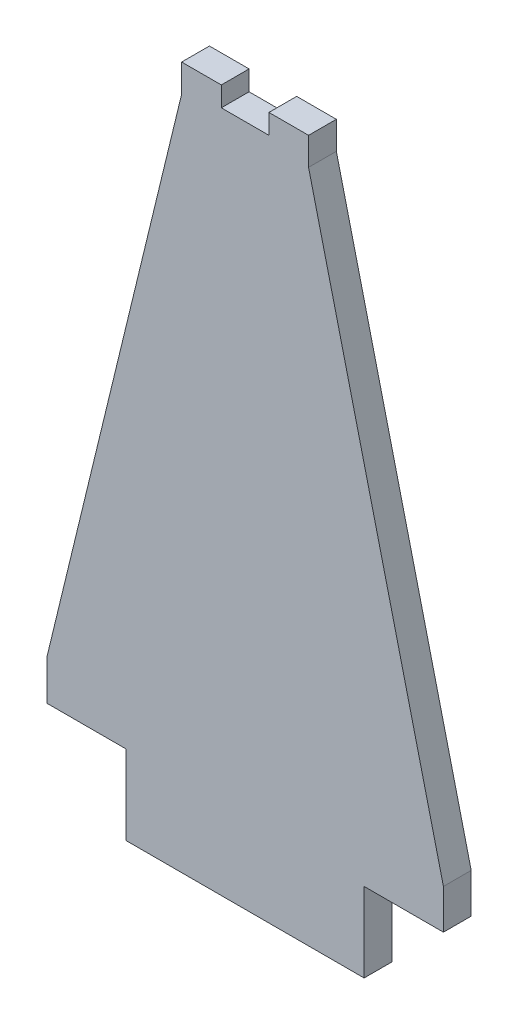
ISO-10303-21;
HEADER;
FILE_DESCRIPTION(('STEP AP214'),'2;1');
FILE_NAME('part.step','',(''),(''),'','','');
FILE_SCHEMA(('AUTOMOTIVE_DESIGN { 1 0 10303 214 1 1 1 1 }'));
ENDSEC;
DATA;
#1=APPLICATION_CONTEXT('core data for automotive mechanical design processes');
#2=APPLICATION_PROTOCOL_DEFINITION('international standard','automotive_design',2000,#1);
#3=PRODUCT_CONTEXT('',#1,'mechanical');
#4=PRODUCT('Part','Part','',(#3));
#5=PRODUCT_RELATED_PRODUCT_CATEGORY('part','',(#4));
#6=PRODUCT_DEFINITION_FORMATION('','',#4);
#7=PRODUCT_DEFINITION_CONTEXT('part definition',#1,'design');
#8=PRODUCT_DEFINITION('design','',#6,#7);
#9=PRODUCT_DEFINITION_SHAPE('','',#8);
#10=(LENGTH_UNIT() NAMED_UNIT(*) SI_UNIT(.MILLI.,.METRE.));
#11=(NAMED_UNIT(*) PLANE_ANGLE_UNIT() SI_UNIT($,.RADIAN.));
#12=(NAMED_UNIT(*) SI_UNIT($,.STERADIAN.) SOLID_ANGLE_UNIT());
#13=UNCERTAINTY_MEASURE_WITH_UNIT(LENGTH_MEASURE(1.E-05),#10,'distance_accuracy_value','');
#14=(GEOMETRIC_REPRESENTATION_CONTEXT(3) GLOBAL_UNCERTAINTY_ASSIGNED_CONTEXT((#13)) GLOBAL_UNIT_ASSIGNED_CONTEXT((#10,
#11,#12)) REPRESENTATION_CONTEXT('',''));
#15=CARTESIAN_POINT('',(0.,0.,0.));
#16=DIRECTION('',(0.,0.,1.));
#17=DIRECTION('',(1.,0.,0.));
#18=AXIS2_PLACEMENT_3D('',#15,#16,#17);
#19=CARTESIAN_POINT('',(0.,1.,0.175));
#20=DIRECTION('',(1.,0.,0.));
#21=DIRECTION('',(0.,1.,0.));
#22=AXIS2_PLACEMENT_3D('',#19,#20,#21);
#23=PLANE('',#22);
#24=DIRECTION('',(0.,-1.,0.));
#25=VECTOR('',#24,1.);
#26=CARTESIAN_POINT('',(0.,1.,-0.175));
#27=LINE('',#26,#25);
#28=CARTESIAN_POINT('',(0.,1.,-0.175));
#29=VERTEX_POINT('',#28);
#30=CARTESIAN_POINT('',(0.,0.,-0.175));
#31=VERTEX_POINT('',#30);
#32=EDGE_CURVE('E188',#29,#31,#27,.T.);
#33=ORIENTED_EDGE('',*,*,#32,.T.);
#34=DIRECTION('',(0.,0.,-1.));
#35=VECTOR('',#34,1.);
#36=CARTESIAN_POINT('',(0.,0.,0.175));
#37=LINE('',#36,#35);
#38=CARTESIAN_POINT('',(0.,0.,0.175));
#39=VERTEX_POINT('',#38);
#40=EDGE_CURVE('E11',#39,#31,#37,.T.);
#41=ORIENTED_EDGE('',*,*,#40,.F.);
#42=DIRECTION('',(0.,-1.,0.));
#43=VECTOR('',#42,1.);
#44=CARTESIAN_POINT('',(0.,1.,0.175));
#45=LINE('',#44,#43);
#46=CARTESIAN_POINT('',(0.,1.,0.175));
#47=VERTEX_POINT('',#46);
#48=EDGE_CURVE('E234',#47,#39,#45,.T.);
#49=ORIENTED_EDGE('',*,*,#48,.F.);
#50=DIRECTION('',(0.,0.,-1.));
#51=VECTOR('',#50,1.);
#52=CARTESIAN_POINT('',(0.,1.,0.175));
#53=LINE('',#52,#51);
#54=EDGE_CURVE('E184',#47,#29,#53,.T.);
#55=ORIENTED_EDGE('',*,*,#54,.T.);
#56=EDGE_LOOP('',(#33,#41,#49,#55));
#57=FACE_BOUND('',#56,.T.);
#58=ADVANCED_FACE('F39',(#57),#23,.F.);
#59=CARTESIAN_POINT('',(0.,0.,0.175));
#60=DIRECTION('',(0.,1.,0.));
#61=DIRECTION('',(-1.,0.,0.));
#62=AXIS2_PLACEMENT_3D('',#59,#60,#61);
#63=PLANE('',#62);
#64=DIRECTION('',(1.,0.,0.));
#65=VECTOR('',#64,1.);
#66=CARTESIAN_POINT('',(0.,0.,-0.175));
#67=LINE('',#66,#65);
#68=CARTESIAN_POINT('',(3.,0.,-0.175));
#69=VERTEX_POINT('',#68);
#70=EDGE_CURVE('E192',#31,#69,#67,.T.);
#71=ORIENTED_EDGE('',*,*,#70,.T.);
#72=DIRECTION('',(0.,0.,-1.));
#73=VECTOR('',#72,1.);
#74=CARTESIAN_POINT('',(3.,0.,0.175));
#75=LINE('',#74,#73);
#76=CARTESIAN_POINT('',(3.,0.,0.175));
#77=VERTEX_POINT('',#76);
#78=EDGE_CURVE('E48',#77,#69,#75,.T.);
#79=ORIENTED_EDGE('',*,*,#78,.F.);
#80=DIRECTION('',(1.,0.,0.));
#81=VECTOR('',#80,1.);
#82=CARTESIAN_POINT('',(0.,0.,0.175));
#83=LINE('',#82,#81);
#84=EDGE_CURVE('E123',#39,#77,#83,.T.);
#85=ORIENTED_EDGE('',*,*,#84,.F.);
#86=ORIENTED_EDGE('',*,*,#40,.T.);
#87=EDGE_LOOP('',(#71,#79,#85,#86));
#88=FACE_BOUND('',#87,.T.);
#89=ADVANCED_FACE('F356',(#88),#63,.F.);
#90=CARTESIAN_POINT('',(3.,0.,0.175));
#91=DIRECTION('',(-1.,0.,0.));
#92=DIRECTION('',(0.,0.,1.));
#93=AXIS2_PLACEMENT_3D('',#90,#91,#92);
#94=PLANE('',#93);
#95=DIRECTION('',(0.,1.,0.));
#96=VECTOR('',#95,1.);
#97=CARTESIAN_POINT('',(3.,0.,-0.175));
#98=LINE('',#97,#96);
#99=CARTESIAN_POINT('',(3.,1.,-0.175));
#100=VERTEX_POINT('',#99);
#101=EDGE_CURVE('E195',#69,#100,#98,.T.);
#102=ORIENTED_EDGE('',*,*,#101,.T.);
#103=DIRECTION('',(0.,0.,-1.));
#104=VECTOR('',#103,1.);
#105=CARTESIAN_POINT('',(3.,1.,0.175));
#106=LINE('',#105,#104);
#107=CARTESIAN_POINT('',(3.,1.,0.175));
#108=VERTEX_POINT('',#107);
#109=EDGE_CURVE('E277',#108,#100,#106,.T.);
#110=ORIENTED_EDGE('',*,*,#109,.F.);
#111=DIRECTION('',(0.,1.,0.));
#112=VECTOR('',#111,1.);
#113=CARTESIAN_POINT('',(3.,0.,0.175));
#114=LINE('',#113,#112);
#115=EDGE_CURVE('E287',#77,#108,#114,.T.);
#116=ORIENTED_EDGE('',*,*,#115,.F.);
#117=ORIENTED_EDGE('',*,*,#78,.T.);
#118=EDGE_LOOP('',(#102,#110,#116,#117));
#119=FACE_BOUND('',#118,.T.);
#120=ADVANCED_FACE('F285',(#119),#94,.F.);
#121=CARTESIAN_POINT('',(3.,1.,0.175));
#122=DIRECTION('',(0.,1.,0.));
#123=DIRECTION('',(-1.,0.,0.));
#124=AXIS2_PLACEMENT_3D('',#121,#122,#123);
#125=PLANE('',#124);
#126=DIRECTION('',(1.,0.,0.));
#127=VECTOR('',#126,1.);
#128=CARTESIAN_POINT('',(3.,1.,-0.175));
#129=LINE('',#128,#127);
#130=CARTESIAN_POINT('',(4.,1.,-0.175));
#131=VERTEX_POINT('',#130);
#132=EDGE_CURVE('E198',#100,#131,#129,.T.);
#133=ORIENTED_EDGE('',*,*,#132,.T.);
#134=DIRECTION('',(0.,0.,-1.));
#135=VECTOR('',#134,1.);
#136=CARTESIAN_POINT('',(4.,1.,0.175));
#137=LINE('',#136,#135);
#138=CARTESIAN_POINT('',(4.,1.,0.175));
#139=VERTEX_POINT('',#138);
#140=EDGE_CURVE('E273',#139,#131,#137,.T.);
#141=ORIENTED_EDGE('',*,*,#140,.F.);
#142=DIRECTION('',(1.,0.,0.));
#143=VECTOR('',#142,1.);
#144=CARTESIAN_POINT('',(3.,1.,0.175));
#145=LINE('',#144,#143);
#146=EDGE_CURVE('E306',#108,#139,#145,.T.);
#147=ORIENTED_EDGE('',*,*,#146,.F.);
#148=ORIENTED_EDGE('',*,*,#109,.T.);
#149=EDGE_LOOP('',(#133,#141,#147,#148));
#150=FACE_BOUND('',#149,.T.);
#151=ADVANCED_FACE('F296',(#150),#125,.F.);
#152=CARTESIAN_POINT('',(4.,1.,0.175));
#153=DIRECTION('',(-1.,0.,0.));
#154=DIRECTION('',(0.,0.,1.));
#155=AXIS2_PLACEMENT_3D('',#152,#153,#154);
#156=PLANE('',#155);
#157=DIRECTION('',(0.,1.,0.));
#158=VECTOR('',#157,1.);
#159=CARTESIAN_POINT('',(4.,1.,-0.175));
#160=LINE('',#159,#158);
#161=CARTESIAN_POINT('',(4.,1.5,-0.175));
#162=VERTEX_POINT('',#161);
#163=EDGE_CURVE('E201',#131,#162,#160,.T.);
#164=ORIENTED_EDGE('',*,*,#163,.T.);
#165=DIRECTION('',(0.,0.,-1.));
#166=VECTOR('',#165,1.);
#167=CARTESIAN_POINT('',(4.,1.5,0.175));
#168=LINE('',#167,#166);
#169=CARTESIAN_POINT('',(4.,1.5,0.175));
#170=VERTEX_POINT('',#169);
#171=EDGE_CURVE('E269',#170,#162,#168,.T.);
#172=ORIENTED_EDGE('',*,*,#171,.F.);
#173=DIRECTION('',(0.,1.,0.));
#174=VECTOR('',#173,1.);
#175=CARTESIAN_POINT('',(4.,1.,0.175));
#176=LINE('',#175,#174);
#177=EDGE_CURVE('E302',#139,#170,#176,.T.);
#178=ORIENTED_EDGE('',*,*,#177,.F.);
#179=ORIENTED_EDGE('',*,*,#140,.T.);
#180=EDGE_LOOP('',(#164,#172,#178,#179));
#181=FACE_BOUND('',#180,.T.);
#182=ADVANCED_FACE('F300',(#181),#156,.F.);
#183=CARTESIAN_POINT('',(4.,1.5,0.175));
#184=DIRECTION('',(-0.971753703944221,-0.235997328100739,0.));
#185=DIRECTION('',(0.235997328100739,-0.971753703944221,0.));
#186=AXIS2_PLACEMENT_3D('',#183,#184,#185);
#187=PLANE('',#186);
#188=DIRECTION('',(-0.23599732810074,0.971753703944221,0.));
#189=VECTOR('',#188,1.);
#190=CARTESIAN_POINT('',(4.,1.5,-0.175));
#191=LINE('',#190,#189);
#192=CARTESIAN_POINT('',(2.3,8.5,-0.175));
#193=VERTEX_POINT('',#192);
#194=EDGE_CURVE('E204',#162,#193,#191,.T.);
#195=ORIENTED_EDGE('',*,*,#194,.T.);
#196=DIRECTION('',(0.,0.,-1.));
#197=VECTOR('',#196,1.);
#198=CARTESIAN_POINT('',(2.3,8.5,0.175));
#199=LINE('',#198,#197);
#200=CARTESIAN_POINT('',(2.3,8.5,0.175));
#201=VERTEX_POINT('',#200);
#202=EDGE_CURVE('E265',#201,#193,#199,.T.);
#203=ORIENTED_EDGE('',*,*,#202,.F.);
#204=DIRECTION('',(-0.23599732810074,0.971753703944221,0.));
#205=VECTOR('',#204,1.);
#206=CARTESIAN_POINT('',(4.,1.5,0.175));
#207=LINE('',#206,#205);
#208=EDGE_CURVE('E305',#170,#201,#207,.T.);
#209=ORIENTED_EDGE('',*,*,#208,.F.);
#210=ORIENTED_EDGE('',*,*,#171,.T.);
#211=EDGE_LOOP('',(#195,#203,#209,#210));
#212=FACE_BOUND('',#211,.T.);
#213=ADVANCED_FACE('F369',(#212),#187,.F.);
#214=CARTESIAN_POINT('',(2.3,8.5,0.175));
#215=DIRECTION('',(-1.,0.,0.));
#216=DIRECTION('',(0.,0.,1.));
#217=AXIS2_PLACEMENT_3D('',#214,#215,#216);
#218=PLANE('',#217);
#219=DIRECTION('',(0.,1.,0.));
#220=VECTOR('',#219,1.);
#221=CARTESIAN_POINT('',(2.3,8.5,-0.175));
#222=LINE('',#221,#220);
#223=CARTESIAN_POINT('',(2.3,8.85,-0.175));
#224=VERTEX_POINT('',#223);
#225=EDGE_CURVE('E207',#193,#224,#222,.T.);
#226=ORIENTED_EDGE('',*,*,#225,.T.);
#227=DIRECTION('',(0.,0.,-1.));
#228=VECTOR('',#227,1.);
#229=CARTESIAN_POINT('',(2.3,8.85,0.175));
#230=LINE('',#229,#228);
#231=CARTESIAN_POINT('',(2.3,8.85,0.175));
#232=VERTEX_POINT('',#231);
#233=EDGE_CURVE('E261',#232,#224,#230,.T.);
#234=ORIENTED_EDGE('',*,*,#233,.F.);
#235=DIRECTION('',(0.,1.,0.));
#236=VECTOR('',#235,1.);
#237=CARTESIAN_POINT('',(2.3,8.5,0.175));
#238=LINE('',#237,#236);
#239=EDGE_CURVE('E310',#201,#232,#238,.T.);
#240=ORIENTED_EDGE('',*,*,#239,.F.);
#241=ORIENTED_EDGE('',*,*,#202,.T.);
#242=EDGE_LOOP('',(#226,#234,#240,#241));
#243=FACE_BOUND('',#242,.T.);
#244=ADVANCED_FACE('F372',(#243),#218,.F.);
#245=CARTESIAN_POINT('',(2.3,8.85,0.175));
#246=DIRECTION('',(0.,-1.,0.));
#247=DIRECTION('',(0.,0.,-1.));
#248=AXIS2_PLACEMENT_3D('',#245,#246,#247);
#249=PLANE('',#248);
#250=DIRECTION('',(-1.,0.,0.));
#251=VECTOR('',#250,1.);
#252=CARTESIAN_POINT('',(2.3,8.85,-0.175));
#253=LINE('',#252,#251);
#254=CARTESIAN_POINT('',(1.8,8.85,-0.175));
#255=VERTEX_POINT('',#254);
#256=EDGE_CURVE('E210',#224,#255,#253,.T.);
#257=ORIENTED_EDGE('',*,*,#256,.T.);
#258=DIRECTION('',(0.,0.,-1.));
#259=VECTOR('',#258,1.);
#260=CARTESIAN_POINT('',(1.8,8.85,0.175));
#261=LINE('',#260,#259);
#262=CARTESIAN_POINT('',(1.8,8.85,0.175));
#263=VERTEX_POINT('',#262);
#264=EDGE_CURVE('E257',#263,#255,#261,.T.);
#265=ORIENTED_EDGE('',*,*,#264,.F.);
#266=DIRECTION('',(-1.,0.,0.));
#267=VECTOR('',#266,1.);
#268=CARTESIAN_POINT('',(2.3,8.85,0.175));
#269=LINE('',#268,#267);
#270=EDGE_CURVE('E317',#232,#263,#269,.T.);
#271=ORIENTED_EDGE('',*,*,#270,.F.);
#272=ORIENTED_EDGE('',*,*,#233,.T.);
#273=EDGE_LOOP('',(#257,#265,#271,#272));
#274=FACE_BOUND('',#273,.T.);
#275=ADVANCED_FACE('F376',(#274),#249,.F.);
#276=CARTESIAN_POINT('',(1.8,8.85,0.175));
#277=DIRECTION('',(1.,0.,0.));
#278=DIRECTION('',(0.,1.,0.));
#279=AXIS2_PLACEMENT_3D('',#276,#277,#278);
#280=PLANE('',#279);
#281=DIRECTION('',(0.,-1.,0.));
#282=VECTOR('',#281,1.);
#283=CARTESIAN_POINT('',(1.8,8.85,-0.175));
#284=LINE('',#283,#282);
#285=CARTESIAN_POINT('',(1.8,8.6,-0.175));
#286=VERTEX_POINT('',#285);
#287=EDGE_CURVE('E213',#255,#286,#284,.T.);
#288=ORIENTED_EDGE('',*,*,#287,.T.);
#289=DIRECTION('',(0.,0.,-1.));
#290=VECTOR('',#289,1.);
#291=CARTESIAN_POINT('',(1.8,8.6,0.175));
#292=LINE('',#291,#290);
#293=CARTESIAN_POINT('',(1.8,8.6,0.175));
#294=VERTEX_POINT('',#293);
#295=EDGE_CURVE('E253',#294,#286,#292,.T.);
#296=ORIENTED_EDGE('',*,*,#295,.F.);
#297=DIRECTION('',(0.,-1.,0.));
#298=VECTOR('',#297,1.);
#299=CARTESIAN_POINT('',(1.8,8.85,0.175));
#300=LINE('',#299,#298);
#301=EDGE_CURVE('E320',#263,#294,#300,.T.);
#302=ORIENTED_EDGE('',*,*,#301,.F.);
#303=ORIENTED_EDGE('',*,*,#264,.T.);
#304=EDGE_LOOP('',(#288,#296,#302,#303));
#305=FACE_BOUND('',#304,.T.);
#306=ADVANCED_FACE('F380',(#305),#280,.F.);
#307=CARTESIAN_POINT('',(1.8,8.6,0.175));
#308=DIRECTION('',(0.,-1.,0.));
#309=DIRECTION('',(0.,0.,-1.));
#310=AXIS2_PLACEMENT_3D('',#307,#308,#309);
#311=PLANE('',#310);
#312=DIRECTION('',(-1.,0.,0.));
#313=VECTOR('',#312,1.);
#314=CARTESIAN_POINT('',(1.8,8.6,-0.175));
#315=LINE('',#314,#313);
#316=CARTESIAN_POINT('',(1.2,8.6,-0.175));
#317=VERTEX_POINT('',#316);
#318=EDGE_CURVE('E216',#286,#317,#315,.T.);
#319=ORIENTED_EDGE('',*,*,#318,.T.);
#320=DIRECTION('',(0.,0.,-1.));
#321=VECTOR('',#320,1.);
#322=CARTESIAN_POINT('',(1.2,8.6,0.175));
#323=LINE('',#322,#321);
#324=CARTESIAN_POINT('',(1.2,8.6,0.175));
#325=VERTEX_POINT('',#324);
#326=EDGE_CURVE('E249',#325,#317,#323,.T.);
#327=ORIENTED_EDGE('',*,*,#326,.F.);
#328=DIRECTION('',(-1.,0.,0.));
#329=VECTOR('',#328,1.);
#330=CARTESIAN_POINT('',(1.8,8.6,0.175));
#331=LINE('',#330,#329);
#332=EDGE_CURVE('E323',#294,#325,#331,.T.);
#333=ORIENTED_EDGE('',*,*,#332,.F.);
#334=ORIENTED_EDGE('',*,*,#295,.T.);
#335=EDGE_LOOP('',(#319,#327,#333,#334));
#336=FACE_BOUND('',#335,.T.);
#337=ADVANCED_FACE('F384',(#336),#311,.F.);
#338=CARTESIAN_POINT('',(1.2,8.6,0.175));
#339=DIRECTION('',(-1.,0.,0.));
#340=DIRECTION('',(0.,0.,1.));
#341=AXIS2_PLACEMENT_3D('',#338,#339,#340);
#342=PLANE('',#341);
#343=DIRECTION('',(0.,1.,0.));
#344=VECTOR('',#343,1.);
#345=CARTESIAN_POINT('',(1.2,8.6,-0.175));
#346=LINE('',#345,#344);
#347=CARTESIAN_POINT('',(1.2,8.85,-0.175));
#348=VERTEX_POINT('',#347);
#349=EDGE_CURVE('E219',#317,#348,#346,.T.);
#350=ORIENTED_EDGE('',*,*,#349,.T.);
#351=DIRECTION('',(0.,0.,-1.));
#352=VECTOR('',#351,1.);
#353=CARTESIAN_POINT('',(1.2,8.85,0.175));
#354=LINE('',#353,#352);
#355=CARTESIAN_POINT('',(1.2,8.85,0.175));
#356=VERTEX_POINT('',#355);
#357=EDGE_CURVE('E245',#356,#348,#354,.T.);
#358=ORIENTED_EDGE('',*,*,#357,.F.);
#359=DIRECTION('',(0.,1.,0.));
#360=VECTOR('',#359,1.);
#361=CARTESIAN_POINT('',(1.2,8.6,0.175));
#362=LINE('',#361,#360);
#363=EDGE_CURVE('E326',#325,#356,#362,.T.);
#364=ORIENTED_EDGE('',*,*,#363,.F.);
#365=ORIENTED_EDGE('',*,*,#326,.T.);
#366=EDGE_LOOP('',(#350,#358,#364,#365));
#367=FACE_BOUND('',#366,.T.);
#368=ADVANCED_FACE('F388',(#367),#342,.F.);
#369=CARTESIAN_POINT('',(1.2,8.85,0.175));
#370=DIRECTION('',(0.,-1.,0.));
#371=DIRECTION('',(0.,0.,-1.));
#372=AXIS2_PLACEMENT_3D('',#369,#370,#371);
#373=PLANE('',#372);
#374=DIRECTION('',(-1.,0.,0.));
#375=VECTOR('',#374,1.);
#376=CARTESIAN_POINT('',(1.2,8.85,-0.175));
#377=LINE('',#376,#375);
#378=CARTESIAN_POINT('',(0.699999999999999,8.85,-0.175));
#379=VERTEX_POINT('',#378);
#380=EDGE_CURVE('E222',#348,#379,#377,.T.);
#381=ORIENTED_EDGE('',*,*,#380,.T.);
#382=DIRECTION('',(0.,0.,-1.));
#383=VECTOR('',#382,1.);
#384=CARTESIAN_POINT('',(0.699999999999999,8.85,0.175));
#385=LINE('',#384,#383);
#386=CARTESIAN_POINT('',(0.699999999999999,8.85,0.175));
#387=VERTEX_POINT('',#386);
#388=EDGE_CURVE('E241',#387,#379,#385,.T.);
#389=ORIENTED_EDGE('',*,*,#388,.F.);
#390=DIRECTION('',(-1.,0.,0.));
#391=VECTOR('',#390,1.);
#392=CARTESIAN_POINT('',(1.2,8.85,0.175));
#393=LINE('',#392,#391);
#394=EDGE_CURVE('E329',#356,#387,#393,.T.);
#395=ORIENTED_EDGE('',*,*,#394,.F.);
#396=ORIENTED_EDGE('',*,*,#357,.T.);
#397=EDGE_LOOP('',(#381,#389,#395,#396));
#398=FACE_BOUND('',#397,.T.);
#399=ADVANCED_FACE('F337',(#398),#373,.F.);
#400=CARTESIAN_POINT('',(0.699999999999999,8.85,0.175));
#401=DIRECTION('',(1.,0.,0.));
#402=DIRECTION('',(0.,0.,-1.));
#403=AXIS2_PLACEMENT_3D('',#400,#401,#402);
#404=PLANE('',#403);
#405=DIRECTION('',(0.,-1.,0.));
#406=VECTOR('',#405,1.);
#407=CARTESIAN_POINT('',(0.699999999999999,8.85,-0.175));
#408=LINE('',#407,#406);
#409=CARTESIAN_POINT('',(0.699999999999999,8.5,-0.175));
#410=VERTEX_POINT('',#409);
#411=EDGE_CURVE('E225',#379,#410,#408,.T.);
#412=ORIENTED_EDGE('',*,*,#411,.T.);
#413=DIRECTION('',(0.,0.,-1.));
#414=VECTOR('',#413,1.);
#415=CARTESIAN_POINT('',(0.699999999999999,8.5,0.175));
#416=LINE('',#415,#414);
#417=CARTESIAN_POINT('',(0.699999999999999,8.5,0.175));
#418=VERTEX_POINT('',#417);
#419=EDGE_CURVE('E177',#418,#410,#416,.T.);
#420=ORIENTED_EDGE('',*,*,#419,.F.);
#421=DIRECTION('',(0.,-1.,0.));
#422=VECTOR('',#421,1.);
#423=CARTESIAN_POINT('',(0.699999999999999,8.85,0.175));
#424=LINE('',#423,#422);
#425=EDGE_CURVE('E166',#387,#418,#424,.T.);
#426=ORIENTED_EDGE('',*,*,#425,.F.);
#427=ORIENTED_EDGE('',*,*,#388,.T.);
#428=EDGE_LOOP('',(#412,#420,#426,#427));
#429=FACE_BOUND('',#428,.T.);
#430=ADVANCED_FACE('F341',(#429),#404,.F.);
#431=CARTESIAN_POINT('',(0.699999999999999,8.5,0.175));
#432=DIRECTION('',(0.971753703944221,-0.235997328100739,0.));
#433=DIRECTION('',(0.235997328100739,0.971753703944221,0.));
#434=AXIS2_PLACEMENT_3D('',#431,#432,#433);
#435=PLANE('',#434);
#436=DIRECTION('',(-0.235997328100739,-0.971753703944221,0.));
#437=VECTOR('',#436,1.);
#438=CARTESIAN_POINT('',(0.699999999999999,8.5,-0.175));
#439=LINE('',#438,#437);
#440=CARTESIAN_POINT('',(-1.,1.5,-0.175));
#441=VERTEX_POINT('',#440);
#442=EDGE_CURVE('E175',#410,#441,#439,.T.);
#443=ORIENTED_EDGE('',*,*,#442,.T.);
#444=DIRECTION('',(0.,0.,-1.));
#445=VECTOR('',#444,1.);
#446=CARTESIAN_POINT('',(-1.,1.5,0.175));
#447=LINE('',#446,#445);
#448=CARTESIAN_POINT('',(-1.,1.5,0.175));
#449=VERTEX_POINT('',#448);
#450=EDGE_CURVE('E172',#449,#441,#447,.T.);
#451=ORIENTED_EDGE('',*,*,#450,.F.);
#452=DIRECTION('',(-0.235997328100739,-0.971753703944221,0.));
#453=VECTOR('',#452,1.);
#454=CARTESIAN_POINT('',(0.699999999999999,8.5,0.175));
#455=LINE('',#454,#453);
#456=EDGE_CURVE('E160',#418,#449,#455,.T.);
#457=ORIENTED_EDGE('',*,*,#456,.F.);
#458=ORIENTED_EDGE('',*,*,#419,.T.);
#459=EDGE_LOOP('',(#443,#451,#457,#458));
#460=FACE_BOUND('',#459,.T.);
#461=ADVANCED_FACE('F173',(#460),#435,.F.);
#462=CARTESIAN_POINT('',(-1.,1.5,0.175));
#463=DIRECTION('',(1.,0.,0.));
#464=DIRECTION('',(0.,0.,-1.));
#465=AXIS2_PLACEMENT_3D('',#462,#463,#464);
#466=PLANE('',#465);
#467=DIRECTION('',(0.,-1.,0.));
#468=VECTOR('',#467,1.);
#469=CARTESIAN_POINT('',(-1.,1.5,-0.175));
#470=LINE('',#469,#468);
#471=CARTESIAN_POINT('',(-1.,1.,-0.175));
#472=VERTEX_POINT('',#471);
#473=EDGE_CURVE('E109',#441,#472,#470,.T.);
#474=ORIENTED_EDGE('',*,*,#473,.T.);
#475=DIRECTION('',(0.,0.,-1.));
#476=VECTOR('',#475,1.);
#477=CARTESIAN_POINT('',(-1.,1.,0.175));
#478=LINE('',#477,#476);
#479=CARTESIAN_POINT('',(-1.,1.,0.175));
#480=VERTEX_POINT('',#479);
#481=EDGE_CURVE('E178',#480,#472,#478,.T.);
#482=ORIENTED_EDGE('',*,*,#481,.F.);
#483=DIRECTION('',(0.,-1.,0.));
#484=VECTOR('',#483,1.);
#485=CARTESIAN_POINT('',(-1.,1.5,0.175));
#486=LINE('',#485,#484);
#487=EDGE_CURVE('E164',#449,#480,#486,.T.);
#488=ORIENTED_EDGE('',*,*,#487,.F.);
#489=ORIENTED_EDGE('',*,*,#450,.T.);
#490=EDGE_LOOP('',(#474,#482,#488,#489));
#491=FACE_BOUND('',#490,.T.);
#492=ADVANCED_FACE('F180',(#491),#466,.F.);
#493=CARTESIAN_POINT('',(-1.,1.,0.175));
#494=DIRECTION('',(0.,1.,0.));
#495=DIRECTION('',(-1.,0.,0.));
#496=AXIS2_PLACEMENT_3D('',#493,#494,#495);
#497=PLANE('',#496);
#498=DIRECTION('',(1.,0.,0.));
#499=VECTOR('',#498,1.);
#500=CARTESIAN_POINT('',(-1.,1.,-0.175));
#501=LINE('',#500,#499);
#502=EDGE_CURVE('E115',#472,#29,#501,.T.);
#503=ORIENTED_EDGE('',*,*,#502,.T.);
#504=ORIENTED_EDGE('',*,*,#54,.F.);
#505=DIRECTION('',(1.,0.,0.));
#506=VECTOR('',#505,1.);
#507=CARTESIAN_POINT('',(-1.,1.,0.175));
#508=LINE('',#507,#506);
#509=EDGE_CURVE('E56',#480,#47,#508,.T.);
#510=ORIENTED_EDGE('',*,*,#509,.F.);
#511=ORIENTED_EDGE('',*,*,#481,.T.);
#512=EDGE_LOOP('',(#503,#504,#510,#511));
#513=FACE_BOUND('',#512,.T.);
#514=ADVANCED_FACE('F345',(#513),#497,.F.);
#515=CARTESIAN_POINT('',(0.,0.,0.175));
#516=DIRECTION('',(0.,0.,1.));
#517=DIRECTION('',(1.,0.,0.));
#518=AXIS2_PLACEMENT_3D('',#515,#516,#517);
#519=PLANE('',#518);
#520=ORIENTED_EDGE('',*,*,#48,.T.);
#521=ORIENTED_EDGE('',*,*,#84,.T.);
#522=ORIENTED_EDGE('',*,*,#115,.T.);
#523=ORIENTED_EDGE('',*,*,#146,.T.);
#524=ORIENTED_EDGE('',*,*,#177,.T.);
#525=ORIENTED_EDGE('',*,*,#208,.T.);
#526=ORIENTED_EDGE('',*,*,#239,.T.);
#527=ORIENTED_EDGE('',*,*,#270,.T.);
#528=ORIENTED_EDGE('',*,*,#301,.T.);
#529=ORIENTED_EDGE('',*,*,#332,.T.);
#530=ORIENTED_EDGE('',*,*,#363,.T.);
#531=ORIENTED_EDGE('',*,*,#394,.T.);
#532=ORIENTED_EDGE('',*,*,#425,.T.);
#533=ORIENTED_EDGE('',*,*,#456,.T.);
#534=ORIENTED_EDGE('',*,*,#487,.T.);
#535=ORIENTED_EDGE('',*,*,#509,.T.);
#536=EDGE_LOOP('',(#520,#521,#522,#523,#524,#525,#526,#527,#528,#529,#530,#531,#532,#533,#534,#535));
#537=FACE_BOUND('',#536,.T.);
#538=ADVANCED_FACE('F162',(#537),#519,.T.);
#539=CARTESIAN_POINT('',(0.,0.,-0.175));
#540=DIRECTION('',(0.,0.,1.));
#541=DIRECTION('',(1.,0.,0.));
#542=AXIS2_PLACEMENT_3D('',#539,#540,#541);
#543=PLANE('',#542);
#544=ORIENTED_EDGE('',*,*,#32,.F.);
#545=ORIENTED_EDGE('',*,*,#502,.F.);
#546=ORIENTED_EDGE('',*,*,#473,.F.);
#547=ORIENTED_EDGE('',*,*,#442,.F.);
#548=ORIENTED_EDGE('',*,*,#411,.F.);
#549=ORIENTED_EDGE('',*,*,#380,.F.);
#550=ORIENTED_EDGE('',*,*,#349,.F.);
#551=ORIENTED_EDGE('',*,*,#318,.F.);
#552=ORIENTED_EDGE('',*,*,#287,.F.);
#553=ORIENTED_EDGE('',*,*,#256,.F.);
#554=ORIENTED_EDGE('',*,*,#225,.F.);
#555=ORIENTED_EDGE('',*,*,#194,.F.);
#556=ORIENTED_EDGE('',*,*,#163,.F.);
#557=ORIENTED_EDGE('',*,*,#132,.F.);
#558=ORIENTED_EDGE('',*,*,#101,.F.);
#559=ORIENTED_EDGE('',*,*,#70,.F.);
#560=EDGE_LOOP('',(#544,#545,#546,#547,#548,#549,#550,#551,#552,#553,#554,#555,#556,#557,#558,#559));
#561=FACE_BOUND('',#560,.T.);
#562=ADVANCED_FACE('F291',(#561),#543,.F.);
#563=CLOSED_SHELL('',(#58,#89,#120,#151,#182,#213,#244,#275,#306,#337,#368,#399,#430,#461,#492,
#514,#538,#562));
#564=MANIFOLD_SOLID_BREP('B2',#563);
#565=ADVANCED_BREP_SHAPE_REPRESENTATION('',(#18,#564),#14);
#566=SHAPE_DEFINITION_REPRESENTATION(#9,#565);
ENDSEC;
END-ISO-10303-21;
